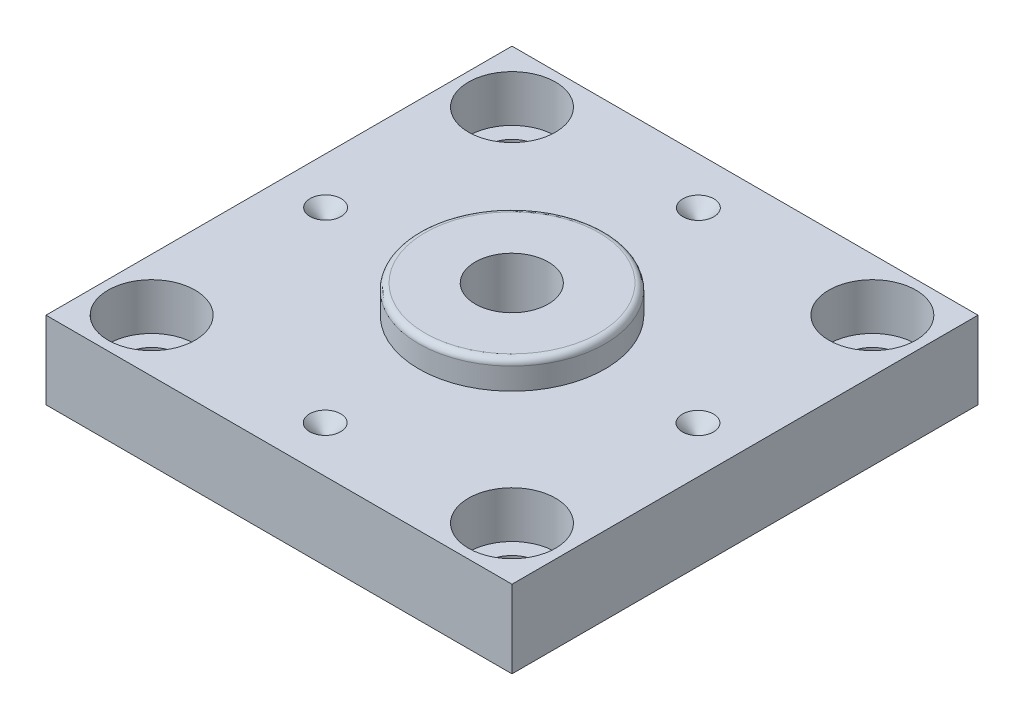
ISO-10303-21;
HEADER;
FILE_DESCRIPTION(('STEP AP214'),'2;1');
FILE_NAME('part.step','',(''),(''),'','','');
FILE_SCHEMA(('AUTOMOTIVE_DESIGN { 1 0 10303 214 1 1 1 1 }'));
ENDSEC;
DATA;
#1=APPLICATION_CONTEXT('core data for automotive mechanical design processes');
#2=APPLICATION_PROTOCOL_DEFINITION('international standard','automotive_design',2000,#1);
#3=PRODUCT_CONTEXT('',#1,'mechanical');
#4=PRODUCT('Part','Part','',(#3));
#5=PRODUCT_RELATED_PRODUCT_CATEGORY('part','',(#4));
#6=PRODUCT_DEFINITION_FORMATION('','',#4);
#7=PRODUCT_DEFINITION_CONTEXT('part definition',#1,'design');
#8=PRODUCT_DEFINITION('design','',#6,#7);
#9=PRODUCT_DEFINITION_SHAPE('','',#8);
#10=(LENGTH_UNIT() NAMED_UNIT(*) SI_UNIT(.MILLI.,.METRE.));
#11=(NAMED_UNIT(*) PLANE_ANGLE_UNIT() SI_UNIT($,.RADIAN.));
#12=(NAMED_UNIT(*) SI_UNIT($,.STERADIAN.) SOLID_ANGLE_UNIT());
#13=UNCERTAINTY_MEASURE_WITH_UNIT(LENGTH_MEASURE(1.E-05),#10,'distance_accuracy_value','');
#14=(GEOMETRIC_REPRESENTATION_CONTEXT(3) GLOBAL_UNCERTAINTY_ASSIGNED_CONTEXT((#13)) GLOBAL_UNIT_ASSIGNED_CONTEXT((#10,
#11,#12)) REPRESENTATION_CONTEXT('',''));
#15=CARTESIAN_POINT('',(0.,0.,0.));
#16=DIRECTION('',(0.,0.,1.));
#17=DIRECTION('',(1.,0.,0.));
#18=AXIS2_PLACEMENT_3D('',#15,#16,#17);
#19=CARTESIAN_POINT('',(75.,25.,-75.));
#20=DIRECTION('',(-1.,0.,0.));
#21=DIRECTION('',(0.,0.,1.));
#22=AXIS2_PLACEMENT_3D('',#19,#20,#21);
#23=PLANE('',#22);
#24=DIRECTION('',(0.,0.,-1.));
#25=VECTOR('',#24,1.);
#26=CARTESIAN_POINT('',(75.,0.,-75.));
#27=LINE('',#26,#25);
#28=CARTESIAN_POINT('',(75.,0.,75.));
#29=VERTEX_POINT('',#28);
#30=CARTESIAN_POINT('',(75.,0.,-75.));
#31=VERTEX_POINT('',#30);
#32=EDGE_CURVE('E215',#29,#31,#27,.T.);
#33=ORIENTED_EDGE('',*,*,#32,.T.);
#34=DIRECTION('',(0.,-1.,0.));
#35=VECTOR('',#34,1.);
#36=CARTESIAN_POINT('',(75.,25.,-75.));
#37=LINE('',#36,#35);
#38=CARTESIAN_POINT('',(75.,25.,-75.));
#39=VERTEX_POINT('',#38);
#40=EDGE_CURVE('E220',#39,#31,#37,.T.);
#41=ORIENTED_EDGE('',*,*,#40,.F.);
#42=DIRECTION('',(0.,0.,-1.));
#43=VECTOR('',#42,1.);
#44=CARTESIAN_POINT('',(75.,25.,-75.));
#45=LINE('',#44,#43);
#46=CARTESIAN_POINT('',(75.,25.,75.));
#47=VERTEX_POINT('',#46);
#48=EDGE_CURVE('E217',#47,#39,#45,.T.);
#49=ORIENTED_EDGE('',*,*,#48,.F.);
#50=DIRECTION('',(0.,-1.,0.));
#51=VECTOR('',#50,1.);
#52=CARTESIAN_POINT('',(75.,25.,75.));
#53=LINE('',#52,#51);
#54=EDGE_CURVE('E227',#47,#29,#53,.T.);
#55=ORIENTED_EDGE('',*,*,#54,.T.);
#56=EDGE_LOOP('',(#33,#41,#49,#55));
#57=FACE_BOUND('',#56,.T.);
#58=ADVANCED_FACE('F52',(#57),#23,.F.);
#59=CARTESIAN_POINT('',(-75.,25.,-75.));
#60=DIRECTION('',(0.,0.,1.));
#61=DIRECTION('',(1.,0.,0.));
#62=AXIS2_PLACEMENT_3D('',#59,#60,#61);
#63=PLANE('',#62);
#64=DIRECTION('',(-1.,0.,0.));
#65=VECTOR('',#64,1.);
#66=CARTESIAN_POINT('',(-75.,0.,-75.));
#67=LINE('',#66,#65);
#68=CARTESIAN_POINT('',(-75.,0.,-75.));
#69=VERTEX_POINT('',#68);
#70=EDGE_CURVE('E235',#31,#69,#67,.T.);
#71=ORIENTED_EDGE('',*,*,#70,.T.);
#72=DIRECTION('',(0.,-1.,0.));
#73=VECTOR('',#72,1.);
#74=CARTESIAN_POINT('',(-75.,25.,-75.));
#75=LINE('',#74,#73);
#76=CARTESIAN_POINT('',(-75.,25.,-75.));
#77=VERTEX_POINT('',#76);
#78=EDGE_CURVE('E243',#77,#69,#75,.T.);
#79=ORIENTED_EDGE('',*,*,#78,.F.);
#80=DIRECTION('',(-1.,0.,0.));
#81=VECTOR('',#80,1.);
#82=CARTESIAN_POINT('',(-75.,25.,-75.));
#83=LINE('',#82,#81);
#84=EDGE_CURVE('E103',#39,#77,#83,.T.);
#85=ORIENTED_EDGE('',*,*,#84,.F.);
#86=ORIENTED_EDGE('',*,*,#40,.T.);
#87=EDGE_LOOP('',(#71,#79,#85,#86));
#88=FACE_BOUND('',#87,.T.);
#89=ADVANCED_FACE('F271',(#88),#63,.F.);
#90=CARTESIAN_POINT('',(-75.,25.,-75.));
#91=DIRECTION('',(1.,0.,0.));
#92=DIRECTION('',(0.,0.,-1.));
#93=AXIS2_PLACEMENT_3D('',#90,#91,#92);
#94=PLANE('',#93);
#95=DIRECTION('',(0.,0.,1.));
#96=VECTOR('',#95,1.);
#97=CARTESIAN_POINT('',(-75.,0.,-75.));
#98=LINE('',#97,#96);
#99=CARTESIAN_POINT('',(-75.,0.,75.));
#100=VERTEX_POINT('',#99);
#101=EDGE_CURVE('E90',#69,#100,#98,.T.);
#102=ORIENTED_EDGE('',*,*,#101,.T.);
#103=DIRECTION('',(0.,-1.,0.));
#104=VECTOR('',#103,1.);
#105=CARTESIAN_POINT('',(-75.,25.,75.));
#106=LINE('',#105,#104);
#107=CARTESIAN_POINT('',(-75.,25.,75.));
#108=VERTEX_POINT('',#107);
#109=EDGE_CURVE('E241',#108,#100,#106,.T.);
#110=ORIENTED_EDGE('',*,*,#109,.F.);
#111=DIRECTION('',(0.,0.,1.));
#112=VECTOR('',#111,1.);
#113=CARTESIAN_POINT('',(-75.,25.,-75.));
#114=LINE('',#113,#112);
#115=EDGE_CURVE('E224',#77,#108,#114,.T.);
#116=ORIENTED_EDGE('',*,*,#115,.F.);
#117=ORIENTED_EDGE('',*,*,#78,.T.);
#118=EDGE_LOOP('',(#102,#110,#116,#117));
#119=FACE_BOUND('',#118,.T.);
#120=ADVANCED_FACE('F277',(#119),#94,.F.);
#121=CARTESIAN_POINT('',(-75.,25.,75.));
#122=DIRECTION('',(0.,0.,-1.));
#123=DIRECTION('',(-1.,0.,0.));
#124=AXIS2_PLACEMENT_3D('',#121,#122,#123);
#125=PLANE('',#124);
#126=DIRECTION('',(1.,0.,0.));
#127=VECTOR('',#126,1.);
#128=CARTESIAN_POINT('',(-75.,0.,75.));
#129=LINE('',#128,#127);
#130=EDGE_CURVE('E92',#100,#29,#129,.T.);
#131=ORIENTED_EDGE('',*,*,#130,.T.);
#132=ORIENTED_EDGE('',*,*,#54,.F.);
#133=DIRECTION('',(1.,0.,0.));
#134=VECTOR('',#133,1.);
#135=CARTESIAN_POINT('',(-75.,25.,75.));
#136=LINE('',#135,#134);
#137=EDGE_CURVE('E72',#108,#47,#136,.T.);
#138=ORIENTED_EDGE('',*,*,#137,.F.);
#139=ORIENTED_EDGE('',*,*,#109,.T.);
#140=EDGE_LOOP('',(#131,#132,#138,#139));
#141=FACE_BOUND('',#140,.T.);
#142=ADVANCED_FACE('F281',(#141),#125,.F.);
#143=CARTESIAN_POINT('',(0.,25.,0.));
#144=DIRECTION('',(0.,1.,0.));
#145=DIRECTION('',(0.,0.,1.));
#146=AXIS2_PLACEMENT_3D('',#143,#144,#145);
#147=PLANE('',#146);
#148=CARTESIAN_POINT('',(-0.0701652145819705,25.,60.0616402943468));
#149=DIRECTION('',(0.,-1.,0.));
#150=DIRECTION('',(-1.,0.,0.));
#151=AXIS2_PLACEMENT_3D('',#148,#149,#150);
#152=CIRCLE('',#151,5.);
#153=CARTESIAN_POINT('',(-5.07016521458198,25.,60.0616402943467));
#154=VERTEX_POINT('',#153);
#155=EDGE_CURVE('E123',#154,#154,#152,.T.);
#156=ORIENTED_EDGE('',*,*,#155,.T.);
#157=EDGE_LOOP('',(#156));
#158=FACE_BOUND('',#157,.T.);
#159=CARTESIAN_POINT('',(59.9914750797654,25.,0.131805508928129));
#160=DIRECTION('',(0.,-1.,0.));
#161=DIRECTION('',(0.,0.,1.));
#162=AXIS2_PLACEMENT_3D('',#159,#160,#161);
#163=CIRCLE('',#162,5.);
#164=CARTESIAN_POINT('',(59.9914750797654,25.,5.13180550892813));
#165=VERTEX_POINT('',#164);
#166=EDGE_CURVE('E127',#165,#165,#163,.T.);
#167=ORIENTED_EDGE('',*,*,#166,.T.);
#168=EDGE_LOOP('',(#167));
#169=FACE_BOUND('',#168,.T.);
#170=CARTESIAN_POINT('',(0.0616402943469969,25.,-59.9298347854187));
#171=DIRECTION('',(0.,-1.,0.));
#172=DIRECTION('',(1.,0.,0.));
#173=AXIS2_PLACEMENT_3D('',#170,#171,#172);
#174=CIRCLE('',#173,5.);
#175=CARTESIAN_POINT('',(5.061640294347,25.,-59.9298347854186));
#176=VERTEX_POINT('',#175);
#177=EDGE_CURVE('E128',#176,#176,#174,.T.);
#178=ORIENTED_EDGE('',*,*,#177,.T.);
#179=EDGE_LOOP('',(#178));
#180=FACE_BOUND('',#179,.T.);
#181=CARTESIAN_POINT('',(-60.,25.,0.));
#182=DIRECTION('',(0.,-1.,0.));
#183=DIRECTION('',(0.,0.,-1.));
#184=AXIS2_PLACEMENT_3D('',#181,#182,#183);
#185=CIRCLE('',#184,5.);
#186=CARTESIAN_POINT('',(-60.,25.,-5.));
#187=VERTEX_POINT('',#186);
#188=EDGE_CURVE('E137',#187,#187,#185,.T.);
#189=ORIENTED_EDGE('',*,*,#188,.T.);
#190=EDGE_LOOP('',(#189));
#191=FACE_BOUND('',#190,.T.);
#192=CARTESIAN_POINT('',(-57.9984000220684,25.,-57.9984000220684));
#193=DIRECTION('',(0.,1.,0.));
#194=DIRECTION('',(0.,0.,1.));
#195=AXIS2_PLACEMENT_3D('',#192,#193,#194);
#196=CIRCLE('',#195,14.);
#197=CARTESIAN_POINT('',(-57.9984000220684,25.,-43.9984000220684));
#198=VERTEX_POINT('',#197);
#199=EDGE_CURVE('E136',#198,#198,#196,.T.);
#200=ORIENTED_EDGE('',*,*,#199,.F.);
#201=EDGE_LOOP('',(#200));
#202=FACE_BOUND('',#201,.T.);
#203=CARTESIAN_POINT('',(58.0015999779316,25.,-57.9984000220684));
#204=DIRECTION('',(0.,1.,0.));
#205=DIRECTION('',(0.,0.,1.));
#206=AXIS2_PLACEMENT_3D('',#203,#204,#205);
#207=CIRCLE('',#206,14.);
#208=CARTESIAN_POINT('',(58.0015999779316,25.,-43.9984000220684));
#209=VERTEX_POINT('',#208);
#210=EDGE_CURVE('E156',#209,#209,#207,.T.);
#211=ORIENTED_EDGE('',*,*,#210,.F.);
#212=EDGE_LOOP('',(#211));
#213=FACE_BOUND('',#212,.T.);
#214=CARTESIAN_POINT('',(58.0015999779316,25.,58.0015999779316));
#215=DIRECTION('',(0.,1.,0.));
#216=DIRECTION('',(0.,0.,1.));
#217=AXIS2_PLACEMENT_3D('',#214,#215,#216);
#218=CIRCLE('',#217,14.);
#219=CARTESIAN_POINT('',(58.0015999779316,25.,72.0015999779316));
#220=VERTEX_POINT('',#219);
#221=EDGE_CURVE('E175',#220,#220,#218,.T.);
#222=ORIENTED_EDGE('',*,*,#221,.F.);
#223=EDGE_LOOP('',(#222));
#224=FACE_BOUND('',#223,.T.);
#225=CARTESIAN_POINT('',(-57.9984000220684,25.,58.0015999779316));
#226=DIRECTION('',(0.,1.,0.));
#227=DIRECTION('',(0.,0.,1.));
#228=AXIS2_PLACEMENT_3D('',#225,#226,#227);
#229=CIRCLE('',#228,14.);
#230=CARTESIAN_POINT('',(-57.9984000220684,25.,72.0015999779316));
#231=VERTEX_POINT('',#230);
#232=EDGE_CURVE('E187',#231,#231,#229,.T.);
#233=ORIENTED_EDGE('',*,*,#232,.F.);
#234=EDGE_LOOP('',(#233));
#235=FACE_BOUND('',#234,.T.);
#236=CARTESIAN_POINT('',(0.,25.,0.));
#237=DIRECTION('',(0.,1.,0.));
#238=DIRECTION('',(0.,0.,1.));
#239=AXIS2_PLACEMENT_3D('',#236,#237,#238);
#240=CIRCLE('',#239,30.);
#241=CARTESIAN_POINT('',(0.,25.,30.));
#242=VERTEX_POINT('',#241);
#243=EDGE_CURVE('E213',#242,#242,#240,.T.);
#244=ORIENTED_EDGE('',*,*,#243,.F.);
#245=EDGE_LOOP('',(#244));
#246=FACE_BOUND('',#245,.T.);
#247=ORIENTED_EDGE('',*,*,#48,.T.);
#248=ORIENTED_EDGE('',*,*,#84,.T.);
#249=ORIENTED_EDGE('',*,*,#115,.T.);
#250=ORIENTED_EDGE('',*,*,#137,.T.);
#251=EDGE_LOOP('',(#247,#248,#249,#250));
#252=FACE_BOUND('',#251,.T.);
#253=ADVANCED_FACE('F283',(#158,#169,#180,#191,#202,#213,#224,#235,#246,#252),#147,.T.);
#254=CARTESIAN_POINT('',(0.,0.,0.));
#255=DIRECTION('',(0.,1.,0.));
#256=DIRECTION('',(0.,0.,1.));
#257=AXIS2_PLACEMENT_3D('',#254,#255,#256);
#258=PLANE('',#257);
#259=CARTESIAN_POINT('',(-57.9984000220684,0.,-57.9984000220684));
#260=DIRECTION('',(0.,1.,0.));
#261=DIRECTION('',(0.,0.,1.));
#262=AXIS2_PLACEMENT_3D('',#259,#260,#261);
#263=CIRCLE('',#262,8.50000000000001);
#264=CARTESIAN_POINT('',(-57.9984000220684,0.,-49.4984000220684));
#265=VERTEX_POINT('',#264);
#266=EDGE_CURVE('E155',#265,#265,#263,.T.);
#267=ORIENTED_EDGE('',*,*,#266,.T.);
#268=EDGE_LOOP('',(#267));
#269=FACE_BOUND('',#268,.T.);
#270=CARTESIAN_POINT('',(58.0015999779316,0.,-57.9984000220684));
#271=DIRECTION('',(0.,1.,0.));
#272=DIRECTION('',(0.,0.,1.));
#273=AXIS2_PLACEMENT_3D('',#270,#271,#272);
#274=CIRCLE('',#273,8.50000000000001);
#275=CARTESIAN_POINT('',(58.0015999779316,0.,-49.4984000220684));
#276=VERTEX_POINT('',#275);
#277=EDGE_CURVE('E169',#276,#276,#274,.T.);
#278=ORIENTED_EDGE('',*,*,#277,.T.);
#279=EDGE_LOOP('',(#278));
#280=FACE_BOUND('',#279,.T.);
#281=CARTESIAN_POINT('',(58.0015999779316,0.,58.0015999779316));
#282=DIRECTION('',(0.,1.,0.));
#283=DIRECTION('',(0.,0.,1.));
#284=AXIS2_PLACEMENT_3D('',#281,#282,#283);
#285=CIRCLE('',#284,8.50000000000001);
#286=CARTESIAN_POINT('',(58.0015999779316,0.,66.5015999779316));
#287=VERTEX_POINT('',#286);
#288=EDGE_CURVE('E184',#287,#287,#285,.T.);
#289=ORIENTED_EDGE('',*,*,#288,.T.);
#290=EDGE_LOOP('',(#289));
#291=FACE_BOUND('',#290,.T.);
#292=CARTESIAN_POINT('',(-57.9984000220684,0.,58.0015999779316));
#293=DIRECTION('',(0.,1.,0.));
#294=DIRECTION('',(0.,0.,1.));
#295=AXIS2_PLACEMENT_3D('',#292,#293,#294);
#296=CIRCLE('',#295,8.50000000000001);
#297=CARTESIAN_POINT('',(-57.9984000220684,0.,66.5015999779316));
#298=VERTEX_POINT('',#297);
#299=EDGE_CURVE('E199',#298,#298,#296,.T.);
#300=ORIENTED_EDGE('',*,*,#299,.T.);
#301=EDGE_LOOP('',(#300));
#302=FACE_BOUND('',#301,.T.);
#303=CARTESIAN_POINT('',(-0.00426246011727728,0.,0.0659027544640647));
#304=DIRECTION('',(0.,1.,0.));
#305=DIRECTION('',(0.,0.,1.));
#306=AXIS2_PLACEMENT_3D('',#303,#304,#305);
#307=CIRCLE('',#306,11.75);
#308=CARTESIAN_POINT('',(-0.00426246011727728,0.,11.8159027544641));
#309=VERTEX_POINT('',#308);
#310=EDGE_CURVE('E208',#309,#309,#307,.T.);
#311=ORIENTED_EDGE('',*,*,#310,.T.);
#312=EDGE_LOOP('',(#311));
#313=FACE_BOUND('',#312,.T.);
#314=ORIENTED_EDGE('',*,*,#32,.F.);
#315=ORIENTED_EDGE('',*,*,#130,.F.);
#316=ORIENTED_EDGE('',*,*,#101,.F.);
#317=ORIENTED_EDGE('',*,*,#70,.F.);
#318=EDGE_LOOP('',(#314,#315,#316,#317));
#319=FACE_BOUND('',#318,.T.);
#320=ADVANCED_FACE('F284',(#269,#280,#291,#302,#313,#319),#258,.F.);
#321=CARTESIAN_POINT('',(0.,34.,0.));
#322=DIRECTION('',(0.,-1.,0.));
#323=DIRECTION('',(0.,0.,-1.));
#324=AXIS2_PLACEMENT_3D('',#321,#322,#323);
#325=CYLINDRICAL_SURFACE('',#324,30.);
#326=CARTESIAN_POINT('',(0.,32.,0.));
#327=DIRECTION('',(0.,1.,0.));
#328=DIRECTION('',(0.,0.,1.));
#329=AXIS2_PLACEMENT_3D('',#326,#327,#328);
#330=CIRCLE('',#329,30.);
#331=CARTESIAN_POINT('',(0.,32.,30.));
#332=VERTEX_POINT('',#331);
#333=EDGE_CURVE('E11',#332,#332,#330,.F.);
#334=ORIENTED_EDGE('',*,*,#333,.T.);
#335=EDGE_LOOP('',(#334));
#336=FACE_BOUND('',#335,.T.);
#337=ORIENTED_EDGE('',*,*,#243,.T.);
#338=EDGE_LOOP('',(#337));
#339=FACE_BOUND('',#338,.T.);
#340=ADVANCED_FACE('F266',(#336,#339),#325,.T.);
#341=CARTESIAN_POINT('',(0.,34.,0.));
#342=DIRECTION('',(0.,1.,0.));
#343=DIRECTION('',(0.,0.,1.));
#344=AXIS2_PLACEMENT_3D('',#341,#342,#343);
#345=PLANE('',#344);
#346=CARTESIAN_POINT('',(-0.00426246011727728,34.,0.0659027544640647));
#347=DIRECTION('',(0.,1.,0.));
#348=DIRECTION('',(0.,0.,1.));
#349=AXIS2_PLACEMENT_3D('',#346,#347,#348);
#350=CIRCLE('',#349,11.75);
#351=CARTESIAN_POINT('',(-0.00426246011727728,34.,11.8159027544641));
#352=VERTEX_POINT('',#351);
#353=EDGE_CURVE('E204',#352,#352,#350,.T.);
#354=ORIENTED_EDGE('',*,*,#353,.F.);
#355=EDGE_LOOP('',(#354));
#356=FACE_BOUND('',#355,.T.);
#357=CARTESIAN_POINT('',(0.,34.,0.));
#358=DIRECTION('',(0.,1.,0.));
#359=DIRECTION('',(0.,0.,1.));
#360=AXIS2_PLACEMENT_3D('',#357,#358,#359);
#361=CIRCLE('',#360,28.);
#362=CARTESIAN_POINT('',(0.,34.,28.));
#363=VERTEX_POINT('',#362);
#364=EDGE_CURVE('E62',#363,#363,#361,.T.);
#365=ORIENTED_EDGE('',*,*,#364,.T.);
#366=EDGE_LOOP('',(#365));
#367=FACE_BOUND('',#366,.T.);
#368=ADVANCED_FACE('F252',(#356,#367),#345,.T.);
#369=CARTESIAN_POINT('',(0.,32.,0.));
#370=DIRECTION('',(0.,1.,0.));
#371=DIRECTION('',(0.,0.,1.));
#372=AXIS2_PLACEMENT_3D('',#369,#370,#371);
#373=TOROIDAL_SURFACE('',#372,28.,2.);
#374=ORIENTED_EDGE('',*,*,#333,.F.);
#375=EDGE_LOOP('',(#374));
#376=FACE_BOUND('',#375,.T.);
#377=ORIENTED_EDGE('',*,*,#364,.F.);
#378=EDGE_LOOP('',(#377));
#379=FACE_BOUND('',#378,.T.);
#380=ADVANCED_FACE('F54',(#376,#379),#373,.T.);
#381=CARTESIAN_POINT('',(-0.00426246011727728,34.,0.0659027544640647));
#382=DIRECTION('',(0.,1.,0.));
#383=DIRECTION('',(0.,0.,1.));
#384=AXIS2_PLACEMENT_3D('',#381,#382,#383);
#385=CYLINDRICAL_SURFACE('',#384,11.75);
#386=ORIENTED_EDGE('',*,*,#310,.F.);
#387=EDGE_LOOP('',(#386));
#388=FACE_BOUND('',#387,.T.);
#389=ORIENTED_EDGE('',*,*,#353,.T.);
#390=EDGE_LOOP('',(#389));
#391=FACE_BOUND('',#390,.T.);
#392=ADVANCED_FACE('F254',(#388,#391),#385,.F.);
#393=CARTESIAN_POINT('',(-57.9984000220684,25.,58.0015999779316));
#394=DIRECTION('',(0.,1.,0.));
#395=DIRECTION('',(0.,0.,1.));
#396=AXIS2_PLACEMENT_3D('',#393,#394,#395);
#397=CYLINDRICAL_SURFACE('',#396,8.50000000000001);
#398=ORIENTED_EDGE('',*,*,#299,.F.);
#399=EDGE_LOOP('',(#398));
#400=FACE_BOUND('',#399,.T.);
#401=CARTESIAN_POINT('',(-57.9984000220684,10.,58.0015999779316));
#402=DIRECTION('',(0.,1.,0.));
#403=DIRECTION('',(0.,0.,1.));
#404=AXIS2_PLACEMENT_3D('',#401,#402,#403);
#405=CIRCLE('',#404,8.50000000000001);
#406=CARTESIAN_POINT('',(-57.9984000220684,10.,66.5015999779316));
#407=VERTEX_POINT('',#406);
#408=EDGE_CURVE('E198',#407,#407,#405,.T.);
#409=ORIENTED_EDGE('',*,*,#408,.T.);
#410=EDGE_LOOP('',(#409));
#411=FACE_BOUND('',#410,.T.);
#412=ADVANCED_FACE('F265',(#400,#411),#397,.F.);
#413=CARTESIAN_POINT('',(-49.4984000220684,10.,58.0015999779316));
#414=DIRECTION('',(0.,-1.,0.));
#415=DIRECTION('',(0.,0.,-1.));
#416=AXIS2_PLACEMENT_3D('',#413,#414,#415);
#417=PLANE('',#416);
#418=ORIENTED_EDGE('',*,*,#408,.F.);
#419=EDGE_LOOP('',(#418));
#420=FACE_BOUND('',#419,.T.);
#421=CARTESIAN_POINT('',(-57.9984000220684,10.,58.0015999779316));
#422=DIRECTION('',(0.,1.,0.));
#423=DIRECTION('',(0.,0.,1.));
#424=AXIS2_PLACEMENT_3D('',#421,#422,#423);
#425=CIRCLE('',#424,14.);
#426=CARTESIAN_POINT('',(-57.9984000220684,10.,72.0015999779316));
#427=VERTEX_POINT('',#426);
#428=EDGE_CURVE('E195',#427,#427,#425,.T.);
#429=ORIENTED_EDGE('',*,*,#428,.T.);
#430=EDGE_LOOP('',(#429));
#431=FACE_BOUND('',#430,.T.);
#432=ADVANCED_FACE('F293',(#420,#431),#417,.F.);
#433=CARTESIAN_POINT('',(-57.9984000220684,25.,58.0015999779316));
#434=DIRECTION('',(0.,1.,0.));
#435=DIRECTION('',(0.,0.,1.));
#436=AXIS2_PLACEMENT_3D('',#433,#434,#435);
#437=CYLINDRICAL_SURFACE('',#436,14.);
#438=ORIENTED_EDGE('',*,*,#428,.F.);
#439=EDGE_LOOP('',(#438));
#440=FACE_BOUND('',#439,.T.);
#441=ORIENTED_EDGE('',*,*,#232,.T.);
#442=EDGE_LOOP('',(#441));
#443=FACE_BOUND('',#442,.T.);
#444=ADVANCED_FACE('F298',(#440,#443),#437,.F.);
#445=CARTESIAN_POINT('',(58.0015999779316,25.,58.0015999779316));
#446=DIRECTION('',(0.,1.,0.));
#447=DIRECTION('',(0.,0.,1.));
#448=AXIS2_PLACEMENT_3D('',#445,#446,#447);
#449=CYLINDRICAL_SURFACE('',#448,8.50000000000001);
#450=ORIENTED_EDGE('',*,*,#288,.F.);
#451=EDGE_LOOP('',(#450));
#452=FACE_BOUND('',#451,.T.);
#453=CARTESIAN_POINT('',(58.0015999779316,10.,58.0015999779316));
#454=DIRECTION('',(0.,1.,0.));
#455=DIRECTION('',(0.,0.,1.));
#456=AXIS2_PLACEMENT_3D('',#453,#454,#455);
#457=CIRCLE('',#456,8.50000000000001);
#458=CARTESIAN_POINT('',(58.0015999779316,10.,66.5015999779316));
#459=VERTEX_POINT('',#458);
#460=EDGE_CURVE('E176',#459,#459,#457,.T.);
#461=ORIENTED_EDGE('',*,*,#460,.T.);
#462=EDGE_LOOP('',(#461));
#463=FACE_BOUND('',#462,.T.);
#464=ADVANCED_FACE('F303',(#452,#463),#449,.F.);
#465=CARTESIAN_POINT('',(66.5015999779316,10.,58.0015999779316));
#466=DIRECTION('',(0.,-1.,0.));
#467=DIRECTION('',(0.,0.,-1.));
#468=AXIS2_PLACEMENT_3D('',#465,#466,#467);
#469=PLANE('',#468);
#470=ORIENTED_EDGE('',*,*,#460,.F.);
#471=EDGE_LOOP('',(#470));
#472=FACE_BOUND('',#471,.T.);
#473=CARTESIAN_POINT('',(58.0015999779316,10.,58.0015999779316));
#474=DIRECTION('',(0.,1.,0.));
#475=DIRECTION('',(0.,0.,1.));
#476=AXIS2_PLACEMENT_3D('',#473,#474,#475);
#477=CIRCLE('',#476,14.);
#478=CARTESIAN_POINT('',(58.0015999779316,10.,72.0015999779316));
#479=VERTEX_POINT('',#478);
#480=EDGE_CURVE('E177',#479,#479,#477,.T.);
#481=ORIENTED_EDGE('',*,*,#480,.T.);
#482=EDGE_LOOP('',(#481));
#483=FACE_BOUND('',#482,.T.);
#484=ADVANCED_FACE('F307',(#472,#483),#469,.F.);
#485=CARTESIAN_POINT('',(58.0015999779316,25.,58.0015999779316));
#486=DIRECTION('',(0.,1.,0.));
#487=DIRECTION('',(0.,0.,1.));
#488=AXIS2_PLACEMENT_3D('',#485,#486,#487);
#489=CYLINDRICAL_SURFACE('',#488,14.);
#490=ORIENTED_EDGE('',*,*,#480,.F.);
#491=EDGE_LOOP('',(#490));
#492=FACE_BOUND('',#491,.T.);
#493=ORIENTED_EDGE('',*,*,#221,.T.);
#494=EDGE_LOOP('',(#493));
#495=FACE_BOUND('',#494,.T.);
#496=ADVANCED_FACE('F313',(#492,#495),#489,.F.);
#497=CARTESIAN_POINT('',(58.0015999779316,25.,-57.9984000220684));
#498=DIRECTION('',(0.,1.,0.));
#499=DIRECTION('',(0.,0.,1.));
#500=AXIS2_PLACEMENT_3D('',#497,#498,#499);
#501=CYLINDRICAL_SURFACE('',#500,8.50000000000001);
#502=ORIENTED_EDGE('',*,*,#277,.F.);
#503=EDGE_LOOP('',(#502));
#504=FACE_BOUND('',#503,.T.);
#505=CARTESIAN_POINT('',(58.0015999779316,10.,-57.9984000220684));
#506=DIRECTION('',(0.,1.,0.));
#507=DIRECTION('',(0.,0.,1.));
#508=AXIS2_PLACEMENT_3D('',#505,#506,#507);
#509=CIRCLE('',#508,8.50000000000001);
#510=CARTESIAN_POINT('',(58.0015999779316,10.,-49.4984000220684));
#511=VERTEX_POINT('',#510);
#512=EDGE_CURVE('E163',#511,#511,#509,.T.);
#513=ORIENTED_EDGE('',*,*,#512,.T.);
#514=EDGE_LOOP('',(#513));
#515=FACE_BOUND('',#514,.T.);
#516=ADVANCED_FACE('F312',(#504,#515),#501,.F.);
#517=CARTESIAN_POINT('',(66.5015999779316,10.,-57.9984000220684));
#518=DIRECTION('',(0.,-1.,0.));
#519=DIRECTION('',(0.,0.,-1.));
#520=AXIS2_PLACEMENT_3D('',#517,#518,#519);
#521=PLANE('',#520);
#522=ORIENTED_EDGE('',*,*,#512,.F.);
#523=EDGE_LOOP('',(#522));
#524=FACE_BOUND('',#523,.T.);
#525=CARTESIAN_POINT('',(58.0015999779316,10.,-57.9984000220684));
#526=DIRECTION('',(0.,1.,0.));
#527=DIRECTION('',(0.,0.,1.));
#528=AXIS2_PLACEMENT_3D('',#525,#526,#527);
#529=CIRCLE('',#528,14.);
#530=CARTESIAN_POINT('',(58.0015999779316,10.,-43.9984000220684));
#531=VERTEX_POINT('',#530);
#532=EDGE_CURVE('E159',#531,#531,#529,.T.);
#533=ORIENTED_EDGE('',*,*,#532,.T.);
#534=EDGE_LOOP('',(#533));
#535=FACE_BOUND('',#534,.T.);
#536=ADVANCED_FACE('F317',(#524,#535),#521,.F.);
#537=CARTESIAN_POINT('',(58.0015999779316,25.,-57.9984000220684));
#538=DIRECTION('',(0.,1.,0.));
#539=DIRECTION('',(0.,0.,1.));
#540=AXIS2_PLACEMENT_3D('',#537,#538,#539);
#541=CYLINDRICAL_SURFACE('',#540,14.);
#542=ORIENTED_EDGE('',*,*,#532,.F.);
#543=EDGE_LOOP('',(#542));
#544=FACE_BOUND('',#543,.T.);
#545=ORIENTED_EDGE('',*,*,#210,.T.);
#546=EDGE_LOOP('',(#545));
#547=FACE_BOUND('',#546,.T.);
#548=ADVANCED_FACE('F323',(#544,#547),#541,.F.);
#549=CARTESIAN_POINT('',(-57.9984000220684,25.,-57.9984000220684));
#550=DIRECTION('',(0.,1.,0.));
#551=DIRECTION('',(0.,0.,1.));
#552=AXIS2_PLACEMENT_3D('',#549,#550,#551);
#553=CYLINDRICAL_SURFACE('',#552,8.50000000000001);
#554=ORIENTED_EDGE('',*,*,#266,.F.);
#555=EDGE_LOOP('',(#554));
#556=FACE_BOUND('',#555,.T.);
#557=CARTESIAN_POINT('',(-57.9984000220684,10.,-57.9984000220684));
#558=DIRECTION('',(0.,1.,0.));
#559=DIRECTION('',(0.,0.,1.));
#560=AXIS2_PLACEMENT_3D('',#557,#558,#559);
#561=CIRCLE('',#560,8.50000000000001);
#562=CARTESIAN_POINT('',(-57.9984000220684,10.,-49.4984000220684));
#563=VERTEX_POINT('',#562);
#564=EDGE_CURVE('E146',#563,#563,#561,.T.);
#565=ORIENTED_EDGE('',*,*,#564,.T.);
#566=EDGE_LOOP('',(#565));
#567=FACE_BOUND('',#566,.T.);
#568=ADVANCED_FACE('F330',(#556,#567),#553,.F.);
#569=CARTESIAN_POINT('',(-49.4984000220684,10.,-57.9984000220684));
#570=DIRECTION('',(0.,-1.,0.));
#571=DIRECTION('',(0.,0.,-1.));
#572=AXIS2_PLACEMENT_3D('',#569,#570,#571);
#573=PLANE('',#572);
#574=ORIENTED_EDGE('',*,*,#564,.F.);
#575=EDGE_LOOP('',(#574));
#576=FACE_BOUND('',#575,.T.);
#577=CARTESIAN_POINT('',(-57.9984000220684,10.,-57.9984000220684));
#578=DIRECTION('',(0.,1.,0.));
#579=DIRECTION('',(0.,0.,1.));
#580=AXIS2_PLACEMENT_3D('',#577,#578,#579);
#581=CIRCLE('',#580,14.);
#582=CARTESIAN_POINT('',(-57.9984000220684,10.,-43.9984000220684));
#583=VERTEX_POINT('',#582);
#584=EDGE_CURVE('E145',#583,#583,#581,.T.);
#585=ORIENTED_EDGE('',*,*,#584,.T.);
#586=EDGE_LOOP('',(#585));
#587=FACE_BOUND('',#586,.T.);
#588=ADVANCED_FACE('F332',(#576,#587),#573,.F.);
#589=CARTESIAN_POINT('',(-57.9984000220684,25.,-57.9984000220684));
#590=DIRECTION('',(0.,1.,0.));
#591=DIRECTION('',(0.,0.,1.));
#592=AXIS2_PLACEMENT_3D('',#589,#590,#591);
#593=CYLINDRICAL_SURFACE('',#592,14.);
#594=ORIENTED_EDGE('',*,*,#584,.F.);
#595=EDGE_LOOP('',(#594));
#596=FACE_BOUND('',#595,.T.);
#597=ORIENTED_EDGE('',*,*,#199,.T.);
#598=EDGE_LOOP('',(#597));
#599=FACE_BOUND('',#598,.T.);
#600=ADVANCED_FACE('F333',(#596,#599),#593,.F.);
#601=CARTESIAN_POINT('',(-60.,25.,0.));
#602=DIRECTION('',(0.,1.,0.));
#603=DIRECTION('',(0.,0.,1.));
#604=AXIS2_PLACEMENT_3D('',#601,#602,#603);
#605=CONICAL_SURFACE('',#604,5.,0.785398163397448);
#606=CARTESIAN_POINT('',(-60.,20.,0.));
#607=VERTEX_POINT('',#606);
#608=VERTEX_LOOP('',#607);
#609=FACE_BOUND('',#608,.T.);
#610=ORIENTED_EDGE('',*,*,#188,.F.);
#611=EDGE_LOOP('',(#610));
#612=FACE_BOUND('',#611,.T.);
#613=ADVANCED_FACE('F338',(#609,#612),#605,.F.);
#614=CARTESIAN_POINT('',(0.0616402943469969,25.,-59.9298347854187));
#615=DIRECTION('',(0.,1.,0.));
#616=DIRECTION('',(-1.,0.,0.));
#617=AXIS2_PLACEMENT_3D('',#614,#615,#616);
#618=CONICAL_SURFACE('',#617,5.,0.785398163397448);
#619=CARTESIAN_POINT('',(0.0616402943469969,20.,-59.9298347854187));
#620=VERTEX_POINT('',#619);
#621=VERTEX_LOOP('',#620);
#622=FACE_BOUND('',#621,.T.);
#623=ORIENTED_EDGE('',*,*,#177,.F.);
#624=EDGE_LOOP('',(#623));
#625=FACE_BOUND('',#624,.T.);
#626=ADVANCED_FACE('F343',(#622,#625),#618,.F.);
#627=CARTESIAN_POINT('',(59.9914750797654,25.,0.131805508928129));
#628=DIRECTION('',(0.,1.,0.));
#629=DIRECTION('',(0.,0.,-1.));
#630=AXIS2_PLACEMENT_3D('',#627,#628,#629);
#631=CONICAL_SURFACE('',#630,5.,0.785398163397448);
#632=CARTESIAN_POINT('',(59.9914750797654,20.,0.131805508928129));
#633=VERTEX_POINT('',#632);
#634=VERTEX_LOOP('',#633);
#635=FACE_BOUND('',#634,.T.);
#636=ORIENTED_EDGE('',*,*,#166,.F.);
#637=EDGE_LOOP('',(#636));
#638=FACE_BOUND('',#637,.T.);
#639=ADVANCED_FACE('F118',(#635,#638),#631,.F.);
#640=CARTESIAN_POINT('',(-0.0701652145819705,25.,60.0616402943468));
#641=DIRECTION('',(0.,1.,0.));
#642=DIRECTION('',(1.,0.,0.));
#643=AXIS2_PLACEMENT_3D('',#640,#641,#642);
#644=CONICAL_SURFACE('',#643,5.,0.785398163397448);
#645=CARTESIAN_POINT('',(-0.0701652145819705,20.,60.0616402943468));
#646=VERTEX_POINT('',#645);
#647=VERTEX_LOOP('',#646);
#648=FACE_BOUND('',#647,.T.);
#649=ORIENTED_EDGE('',*,*,#155,.F.);
#650=EDGE_LOOP('',(#649));
#651=FACE_BOUND('',#650,.T.);
#652=ADVANCED_FACE('F116',(#648,#651),#644,.F.);
#653=CLOSED_SHELL('',(#58,#89,#120,#142,#253,#320,#340,#368,#380,#392,#412,#432,#444,#464,#484,
#496,#516,#536,#548,#568,#588,#600,#613,#626,#639,#652));
#654=MANIFOLD_SOLID_BREP('B2',#653);
#655=ADVANCED_BREP_SHAPE_REPRESENTATION('',(#18,#654),#14);
#656=SHAPE_DEFINITION_REPRESENTATION(#9,#655);
ENDSEC;
END-ISO-10303-21;
